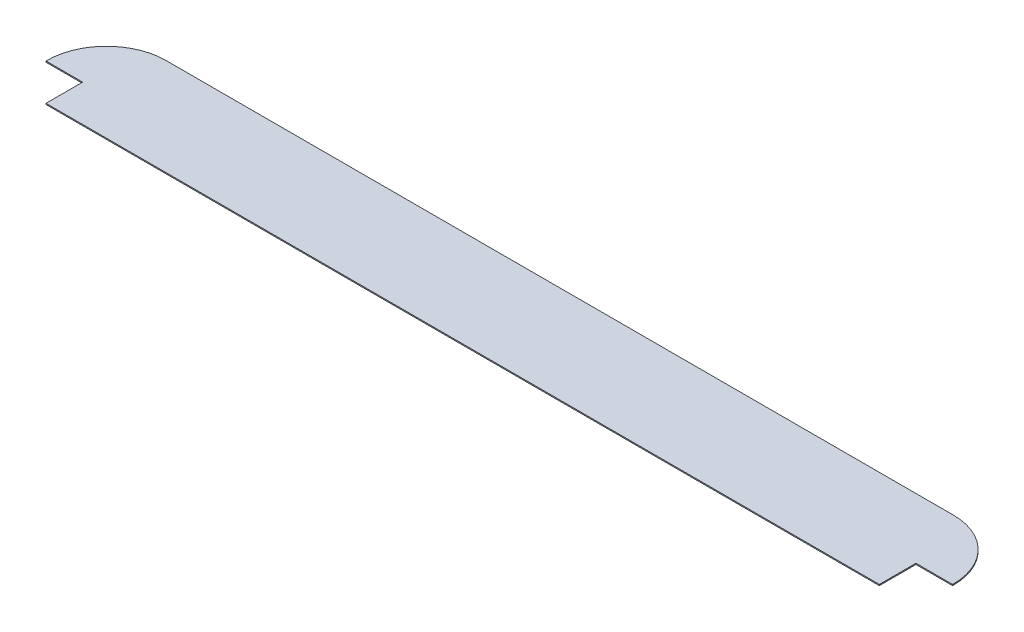
ISO-10303-21;
HEADER;
FILE_DESCRIPTION(('STEP AP214'),'2;1');
FILE_NAME('part.step','',(''),(''),'','','');
FILE_SCHEMA(('AUTOMOTIVE_DESIGN { 1 0 10303 214 1 1 1 1 }'));
ENDSEC;
DATA;
#1=APPLICATION_CONTEXT('core data for automotive mechanical design processes');
#2=APPLICATION_PROTOCOL_DEFINITION('international standard','automotive_design',2000,#1);
#3=PRODUCT_CONTEXT('',#1,'mechanical');
#4=PRODUCT('Part','Part','',(#3));
#5=PRODUCT_RELATED_PRODUCT_CATEGORY('part','',(#4));
#6=PRODUCT_DEFINITION_FORMATION('','',#4);
#7=PRODUCT_DEFINITION_CONTEXT('part definition',#1,'design');
#8=PRODUCT_DEFINITION('design','',#6,#7);
#9=PRODUCT_DEFINITION_SHAPE('','',#8);
#10=(LENGTH_UNIT() NAMED_UNIT(*) SI_UNIT(.MILLI.,.METRE.));
#11=(NAMED_UNIT(*) PLANE_ANGLE_UNIT() SI_UNIT($,.RADIAN.));
#12=(NAMED_UNIT(*) SI_UNIT($,.STERADIAN.) SOLID_ANGLE_UNIT());
#13=UNCERTAINTY_MEASURE_WITH_UNIT(LENGTH_MEASURE(1.E-05),#10,'distance_accuracy_value','');
#14=(GEOMETRIC_REPRESENTATION_CONTEXT(3) GLOBAL_UNCERTAINTY_ASSIGNED_CONTEXT((#13)) GLOBAL_UNIT_ASSIGNED_CONTEXT((#10,
#11,#12)) REPRESENTATION_CONTEXT('',''));
#15=CARTESIAN_POINT('',(0.,0.,0.));
#16=DIRECTION('',(0.,0.,1.));
#17=DIRECTION('',(1.,0.,0.));
#18=AXIS2_PLACEMENT_3D('',#15,#16,#17);
#19=CARTESIAN_POINT('',(-430.,-1.2,12.));
#20=DIRECTION('',(0.,1.,0.));
#21=DIRECTION('',(0.,0.,1.));
#22=AXIS2_PLACEMENT_3D('',#19,#20,#21);
#23=CYLINDRICAL_SURFACE('',#22,65.);
#24=CARTESIAN_POINT('',(-430.,0.,12.));
#25=DIRECTION('',(0.,1.,0.));
#26=DIRECTION('',(0.,0.,-1.));
#27=AXIS2_PLACEMENT_3D('',#24,#25,#26);
#28=CIRCLE('',#27,65.);
#29=CARTESIAN_POINT('',(-429.999999999999,0.,-53.));
#30=VERTEX_POINT('',#29);
#31=CARTESIAN_POINT('',(-495.,0.,12.0000000000005));
#32=VERTEX_POINT('',#31);
#33=EDGE_CURVE('E142',#30,#32,#28,.T.);
#34=ORIENTED_EDGE('',*,*,#33,.F.);
#35=DIRECTION('',(0.,1.,0.));
#36=VECTOR('',#35,1.);
#37=CARTESIAN_POINT('',(-429.999999999999,-1.2,-53.));
#38=LINE('',#37,#36);
#39=CARTESIAN_POINT('',(-429.999999999999,-1.2,-53.));
#40=VERTEX_POINT('',#39);
#41=EDGE_CURVE('E11',#40,#30,#38,.T.);
#42=ORIENTED_EDGE('',*,*,#41,.F.);
#43=CARTESIAN_POINT('',(-430.,-1.2,12.));
#44=DIRECTION('',(0.,1.,0.));
#45=DIRECTION('',(0.,0.,-1.));
#46=AXIS2_PLACEMENT_3D('',#43,#44,#45);
#47=CIRCLE('',#46,65.);
#48=CARTESIAN_POINT('',(-495.,-1.2,12.0000000000005));
#49=VERTEX_POINT('',#48);
#50=EDGE_CURVE('E168',#40,#49,#47,.T.);
#51=ORIENTED_EDGE('',*,*,#50,.T.);
#52=DIRECTION('',(0.,1.,0.));
#53=VECTOR('',#52,1.);
#54=CARTESIAN_POINT('',(-495.,-1.2,12.0000000000005));
#55=LINE('',#54,#53);
#56=EDGE_CURVE('E36',#49,#32,#55,.T.);
#57=ORIENTED_EDGE('',*,*,#56,.T.);
#58=EDGE_LOOP('',(#34,#42,#51,#57));
#59=FACE_BOUND('',#58,.T.);
#60=ADVANCED_FACE('F33',(#59),#23,.T.);
#61=CARTESIAN_POINT('',(-429.999999999999,-1.2,-53.));
#62=DIRECTION('',(0.,0.,-1.));
#63=DIRECTION('',(-1.,0.,0.));
#64=AXIS2_PLACEMENT_3D('',#61,#62,#63);
#65=PLANE('',#64);
#66=DIRECTION('',(-1.,0.,0.));
#67=VECTOR('',#66,1.);
#68=CARTESIAN_POINT('',(-429.999999999999,0.,-53.));
#69=LINE('',#68,#67);
#70=CARTESIAN_POINT('',(430.,0.,-53.));
#71=VERTEX_POINT('',#70);
#72=EDGE_CURVE('E166',#71,#30,#69,.T.);
#73=ORIENTED_EDGE('',*,*,#72,.F.);
#74=DIRECTION('',(0.,1.,0.));
#75=VECTOR('',#74,1.);
#76=CARTESIAN_POINT('',(430.,-1.2,-53.));
#77=LINE('',#76,#75);
#78=CARTESIAN_POINT('',(430.,-1.2,-53.));
#79=VERTEX_POINT('',#78);
#80=EDGE_CURVE('E42',#79,#71,#77,.T.);
#81=ORIENTED_EDGE('',*,*,#80,.F.);
#82=DIRECTION('',(-1.,0.,0.));
#83=VECTOR('',#82,1.);
#84=CARTESIAN_POINT('',(-429.999999999999,-1.2,-53.));
#85=LINE('',#84,#83);
#86=EDGE_CURVE('E132',#79,#40,#85,.T.);
#87=ORIENTED_EDGE('',*,*,#86,.T.);
#88=ORIENTED_EDGE('',*,*,#41,.T.);
#89=EDGE_LOOP('',(#73,#81,#87,#88));
#90=FACE_BOUND('',#89,.T.);
#91=ADVANCED_FACE('F184',(#90),#65,.T.);
#92=CARTESIAN_POINT('',(430.,-1.2,12.));
#93=DIRECTION('',(0.,1.,0.));
#94=DIRECTION('',(0.,0.,1.));
#95=AXIS2_PLACEMENT_3D('',#92,#93,#94);
#96=CYLINDRICAL_SURFACE('',#95,65.);
#97=CARTESIAN_POINT('',(430.,0.,12.));
#98=DIRECTION('',(0.,1.,0.));
#99=DIRECTION('',(0.,0.,-1.));
#100=AXIS2_PLACEMENT_3D('',#97,#98,#99);
#101=CIRCLE('',#100,65.);
#102=CARTESIAN_POINT('',(495.,0.,12.0000000000005));
#103=VERTEX_POINT('',#102);
#104=EDGE_CURVE('E119',#103,#71,#101,.T.);
#105=ORIENTED_EDGE('',*,*,#104,.F.);
#106=DIRECTION('',(0.,1.,0.));
#107=VECTOR('',#106,1.);
#108=CARTESIAN_POINT('',(495.,-1.2,12.0000000000005));
#109=LINE('',#108,#107);
#110=CARTESIAN_POINT('',(495.,-1.2,12.0000000000005));
#111=VERTEX_POINT('',#110);
#112=EDGE_CURVE('E114',#111,#103,#109,.T.);
#113=ORIENTED_EDGE('',*,*,#112,.F.);
#114=CARTESIAN_POINT('',(430.,-1.2,12.));
#115=DIRECTION('',(0.,1.,0.));
#116=DIRECTION('',(0.,0.,-1.));
#117=AXIS2_PLACEMENT_3D('',#114,#115,#116);
#118=CIRCLE('',#117,65.);
#119=EDGE_CURVE('E117',#111,#79,#118,.T.);
#120=ORIENTED_EDGE('',*,*,#119,.T.);
#121=ORIENTED_EDGE('',*,*,#80,.T.);
#122=EDGE_LOOP('',(#105,#113,#120,#121));
#123=FACE_BOUND('',#122,.T.);
#124=ADVANCED_FACE('F116',(#123),#96,.T.);
#125=CARTESIAN_POINT('',(495.,-1.2,13.));
#126=DIRECTION('',(1.,0.,0.));
#127=DIRECTION('',(0.,0.,-1.));
#128=AXIS2_PLACEMENT_3D('',#125,#126,#127);
#129=PLANE('',#128);
#130=DIRECTION('',(0.,0.,-1.));
#131=VECTOR('',#130,1.);
#132=CARTESIAN_POINT('',(495.,0.,13.));
#133=LINE('',#132,#131);
#134=CARTESIAN_POINT('',(495.,0.,13.));
#135=VERTEX_POINT('',#134);
#136=EDGE_CURVE('E163',#135,#103,#133,.T.);
#137=ORIENTED_EDGE('',*,*,#136,.F.);
#138=DIRECTION('',(0.,1.,0.));
#139=VECTOR('',#138,1.);
#140=CARTESIAN_POINT('',(495.,-1.2,13.));
#141=LINE('',#140,#139);
#142=CARTESIAN_POINT('',(495.,-1.2,13.));
#143=VERTEX_POINT('',#142);
#144=EDGE_CURVE('E124',#143,#135,#141,.T.);
#145=ORIENTED_EDGE('',*,*,#144,.F.);
#146=DIRECTION('',(0.,0.,-1.));
#147=VECTOR('',#146,1.);
#148=CARTESIAN_POINT('',(495.,-1.2,13.));
#149=LINE('',#148,#147);
#150=EDGE_CURVE('E130',#143,#111,#149,.T.);
#151=ORIENTED_EDGE('',*,*,#150,.T.);
#152=ORIENTED_EDGE('',*,*,#112,.T.);
#153=EDGE_LOOP('',(#137,#145,#151,#152));
#154=FACE_BOUND('',#153,.T.);
#155=ADVANCED_FACE('F134',(#154),#129,.T.);
#156=CARTESIAN_POINT('',(495.,-1.2,13.));
#157=DIRECTION('',(0.,0.,1.));
#158=DIRECTION('',(1.,0.,0.));
#159=AXIS2_PLACEMENT_3D('',#156,#157,#158);
#160=PLANE('',#159);
#161=DIRECTION('',(1.,0.,0.));
#162=VECTOR('',#161,1.);
#163=CARTESIAN_POINT('',(495.,0.,13.));
#164=LINE('',#163,#162);
#165=CARTESIAN_POINT('',(455.,0.,13.));
#166=VERTEX_POINT('',#165);
#167=EDGE_CURVE('E160',#166,#135,#164,.T.);
#168=ORIENTED_EDGE('',*,*,#167,.F.);
#169=DIRECTION('',(0.,1.,0.));
#170=VECTOR('',#169,1.);
#171=CARTESIAN_POINT('',(455.,-1.2,13.));
#172=LINE('',#171,#170);
#173=CARTESIAN_POINT('',(455.,-1.2,13.));
#174=VERTEX_POINT('',#173);
#175=EDGE_CURVE('E172',#174,#166,#172,.T.);
#176=ORIENTED_EDGE('',*,*,#175,.F.);
#177=DIRECTION('',(1.,0.,0.));
#178=VECTOR('',#177,1.);
#179=CARTESIAN_POINT('',(495.,-1.2,13.));
#180=LINE('',#179,#178);
#181=EDGE_CURVE('E135',#174,#143,#180,.T.);
#182=ORIENTED_EDGE('',*,*,#181,.T.);
#183=ORIENTED_EDGE('',*,*,#144,.T.);
#184=EDGE_LOOP('',(#168,#176,#182,#183));
#185=FACE_BOUND('',#184,.T.);
#186=ADVANCED_FACE('F197',(#185),#160,.T.);
#187=CARTESIAN_POINT('',(455.,-1.2,53.));
#188=DIRECTION('',(1.,0.,0.));
#189=DIRECTION('',(0.,0.,-1.));
#190=AXIS2_PLACEMENT_3D('',#187,#188,#189);
#191=PLANE('',#190);
#192=DIRECTION('',(0.,0.,-1.));
#193=VECTOR('',#192,1.);
#194=CARTESIAN_POINT('',(455.,0.,53.));
#195=LINE('',#194,#193);
#196=CARTESIAN_POINT('',(455.,0.,53.));
#197=VERTEX_POINT('',#196);
#198=EDGE_CURVE('E157',#197,#166,#195,.T.);
#199=ORIENTED_EDGE('',*,*,#198,.F.);
#200=DIRECTION('',(0.,1.,0.));
#201=VECTOR('',#200,1.);
#202=CARTESIAN_POINT('',(455.,-1.2,53.));
#203=LINE('',#202,#201);
#204=CARTESIAN_POINT('',(455.,-1.2,53.));
#205=VERTEX_POINT('',#204);
#206=EDGE_CURVE('E174',#205,#197,#203,.T.);
#207=ORIENTED_EDGE('',*,*,#206,.F.);
#208=DIRECTION('',(0.,0.,-1.));
#209=VECTOR('',#208,1.);
#210=CARTESIAN_POINT('',(455.,-1.2,53.));
#211=LINE('',#210,#209);
#212=EDGE_CURVE('E137',#205,#174,#211,.T.);
#213=ORIENTED_EDGE('',*,*,#212,.T.);
#214=ORIENTED_EDGE('',*,*,#175,.T.);
#215=EDGE_LOOP('',(#199,#207,#213,#214));
#216=FACE_BOUND('',#215,.T.);
#217=ADVANCED_FACE('F200',(#216),#191,.T.);
#218=CARTESIAN_POINT('',(-455.,-1.2,53.));
#219=DIRECTION('',(0.,0.,1.));
#220=DIRECTION('',(1.,0.,0.));
#221=AXIS2_PLACEMENT_3D('',#218,#219,#220);
#222=PLANE('',#221);
#223=DIRECTION('',(1.,0.,0.));
#224=VECTOR('',#223,1.);
#225=CARTESIAN_POINT('',(-455.,0.,53.));
#226=LINE('',#225,#224);
#227=CARTESIAN_POINT('',(-455.,0.,53.));
#228=VERTEX_POINT('',#227);
#229=EDGE_CURVE('E154',#228,#197,#226,.T.);
#230=ORIENTED_EDGE('',*,*,#229,.F.);
#231=DIRECTION('',(0.,1.,0.));
#232=VECTOR('',#231,1.);
#233=CARTESIAN_POINT('',(-455.,-1.2,53.));
#234=LINE('',#233,#232);
#235=CARTESIAN_POINT('',(-455.,-1.2,53.));
#236=VERTEX_POINT('',#235);
#237=EDGE_CURVE('E176',#236,#228,#234,.T.);
#238=ORIENTED_EDGE('',*,*,#237,.F.);
#239=DIRECTION('',(1.,0.,0.));
#240=VECTOR('',#239,1.);
#241=CARTESIAN_POINT('',(-455.,-1.2,53.));
#242=LINE('',#241,#240);
#243=EDGE_CURVE('E323',#236,#205,#242,.T.);
#244=ORIENTED_EDGE('',*,*,#243,.T.);
#245=ORIENTED_EDGE('',*,*,#206,.T.);
#246=EDGE_LOOP('',(#230,#238,#244,#245));
#247=FACE_BOUND('',#246,.T.);
#248=ADVANCED_FACE('F204',(#247),#222,.T.);
#249=CARTESIAN_POINT('',(-455.,-1.2,53.));
#250=DIRECTION('',(-1.,0.,0.));
#251=DIRECTION('',(0.,0.,1.));
#252=AXIS2_PLACEMENT_3D('',#249,#250,#251);
#253=PLANE('',#252);
#254=DIRECTION('',(0.,0.,1.));
#255=VECTOR('',#254,1.);
#256=CARTESIAN_POINT('',(-455.,0.,53.));
#257=LINE('',#256,#255);
#258=CARTESIAN_POINT('',(-455.,0.,13.));
#259=VERTEX_POINT('',#258);
#260=EDGE_CURVE('E151',#259,#228,#257,.T.);
#261=ORIENTED_EDGE('',*,*,#260,.F.);
#262=DIRECTION('',(0.,1.,0.));
#263=VECTOR('',#262,1.);
#264=CARTESIAN_POINT('',(-455.,-1.2,13.));
#265=LINE('',#264,#263);
#266=CARTESIAN_POINT('',(-455.,-1.2,13.));
#267=VERTEX_POINT('',#266);
#268=EDGE_CURVE('E178',#267,#259,#265,.T.);
#269=ORIENTED_EDGE('',*,*,#268,.F.);
#270=DIRECTION('',(0.,0.,1.));
#271=VECTOR('',#270,1.);
#272=CARTESIAN_POINT('',(-455.,-1.2,53.));
#273=LINE('',#272,#271);
#274=EDGE_CURVE('E319',#267,#236,#273,.T.);
#275=ORIENTED_EDGE('',*,*,#274,.T.);
#276=ORIENTED_EDGE('',*,*,#237,.T.);
#277=EDGE_LOOP('',(#261,#269,#275,#276));
#278=FACE_BOUND('',#277,.T.);
#279=ADVANCED_FACE('F208',(#278),#253,.T.);
#280=CARTESIAN_POINT('',(-495.,-1.2,13.));
#281=DIRECTION('',(0.,0.,1.));
#282=DIRECTION('',(1.,0.,0.));
#283=AXIS2_PLACEMENT_3D('',#280,#281,#282);
#284=PLANE('',#283);
#285=DIRECTION('',(1.,0.,0.));
#286=VECTOR('',#285,1.);
#287=CARTESIAN_POINT('',(-495.,0.,13.));
#288=LINE('',#287,#286);
#289=CARTESIAN_POINT('',(-495.,0.,13.));
#290=VERTEX_POINT('',#289);
#291=EDGE_CURVE('E148',#290,#259,#288,.T.);
#292=ORIENTED_EDGE('',*,*,#291,.F.);
#293=DIRECTION('',(0.,1.,0.));
#294=VECTOR('',#293,1.);
#295=CARTESIAN_POINT('',(-495.,-1.2,13.));
#296=LINE('',#295,#294);
#297=CARTESIAN_POINT('',(-495.,-1.2,13.));
#298=VERTEX_POINT('',#297);
#299=EDGE_CURVE('E179',#298,#290,#296,.T.);
#300=ORIENTED_EDGE('',*,*,#299,.F.);
#301=DIRECTION('',(1.,0.,0.));
#302=VECTOR('',#301,1.);
#303=CARTESIAN_POINT('',(-495.,-1.2,13.));
#304=LINE('',#303,#302);
#305=EDGE_CURVE('E330',#298,#267,#304,.T.);
#306=ORIENTED_EDGE('',*,*,#305,.T.);
#307=ORIENTED_EDGE('',*,*,#268,.T.);
#308=EDGE_LOOP('',(#292,#300,#306,#307));
#309=FACE_BOUND('',#308,.T.);
#310=ADVANCED_FACE('F212',(#309),#284,.T.);
#311=CARTESIAN_POINT('',(-495.,-1.2,13.));
#312=DIRECTION('',(-1.,0.,0.));
#313=DIRECTION('',(0.,0.,1.));
#314=AXIS2_PLACEMENT_3D('',#311,#312,#313);
#315=PLANE('',#314);
#316=DIRECTION('',(0.,0.,1.));
#317=VECTOR('',#316,1.);
#318=CARTESIAN_POINT('',(-495.,0.,13.));
#319=LINE('',#318,#317);
#320=EDGE_CURVE('E145',#32,#290,#319,.T.);
#321=ORIENTED_EDGE('',*,*,#320,.F.);
#322=ORIENTED_EDGE('',*,*,#56,.F.);
#323=DIRECTION('',(0.,0.,1.));
#324=VECTOR('',#323,1.);
#325=CARTESIAN_POINT('',(-495.,-1.2,13.));
#326=LINE('',#325,#324);
#327=EDGE_CURVE('E332',#49,#298,#326,.T.);
#328=ORIENTED_EDGE('',*,*,#327,.T.);
#329=ORIENTED_EDGE('',*,*,#299,.T.);
#330=EDGE_LOOP('',(#321,#322,#328,#329));
#331=FACE_BOUND('',#330,.T.);
#332=ADVANCED_FACE('F181',(#331),#315,.T.);
#333=CARTESIAN_POINT('',(-430.,-1.2,12.));
#334=DIRECTION('',(0.,-1.,0.));
#335=DIRECTION('',(0.,0.,-1.));
#336=AXIS2_PLACEMENT_3D('',#333,#334,#335);
#337=PLANE('',#336);
#338=ORIENTED_EDGE('',*,*,#50,.F.);
#339=ORIENTED_EDGE('',*,*,#86,.F.);
#340=ORIENTED_EDGE('',*,*,#119,.F.);
#341=ORIENTED_EDGE('',*,*,#150,.F.);
#342=ORIENTED_EDGE('',*,*,#181,.F.);
#343=ORIENTED_EDGE('',*,*,#212,.F.);
#344=ORIENTED_EDGE('',*,*,#243,.F.);
#345=ORIENTED_EDGE('',*,*,#274,.F.);
#346=ORIENTED_EDGE('',*,*,#305,.F.);
#347=ORIENTED_EDGE('',*,*,#327,.F.);
#348=EDGE_LOOP('',(#338,#339,#340,#341,#342,#343,#344,#345,#346,#347));
#349=FACE_BOUND('',#348,.T.);
#350=ADVANCED_FACE('F128',(#349),#337,.T.);
#351=CARTESIAN_POINT('',(-430.,0.,12.));
#352=DIRECTION('',(0.,-1.,0.));
#353=DIRECTION('',(0.,0.,-1.));
#354=AXIS2_PLACEMENT_3D('',#351,#352,#353);
#355=PLANE('',#354);
#356=ORIENTED_EDGE('',*,*,#33,.T.);
#357=ORIENTED_EDGE('',*,*,#320,.T.);
#358=ORIENTED_EDGE('',*,*,#291,.T.);
#359=ORIENTED_EDGE('',*,*,#260,.T.);
#360=ORIENTED_EDGE('',*,*,#229,.T.);
#361=ORIENTED_EDGE('',*,*,#198,.T.);
#362=ORIENTED_EDGE('',*,*,#167,.T.);
#363=ORIENTED_EDGE('',*,*,#136,.T.);
#364=ORIENTED_EDGE('',*,*,#104,.T.);
#365=ORIENTED_EDGE('',*,*,#72,.T.);
#366=EDGE_LOOP('',(#356,#357,#358,#359,#360,#361,#362,#363,#364,#365));
#367=FACE_BOUND('',#366,.T.);
#368=ADVANCED_FACE('F183',(#367),#355,.F.);
#369=CLOSED_SHELL('',(#60,#91,#124,#155,#186,#217,#248,#279,#310,#332,#350,#368));
#370=MANIFOLD_SOLID_BREP('B2',#369);
#371=ADVANCED_BREP_SHAPE_REPRESENTATION('',(#18,#370),#14);
#372=SHAPE_DEFINITION_REPRESENTATION(#9,#371);
ENDSEC;
END-ISO-10303-21;
